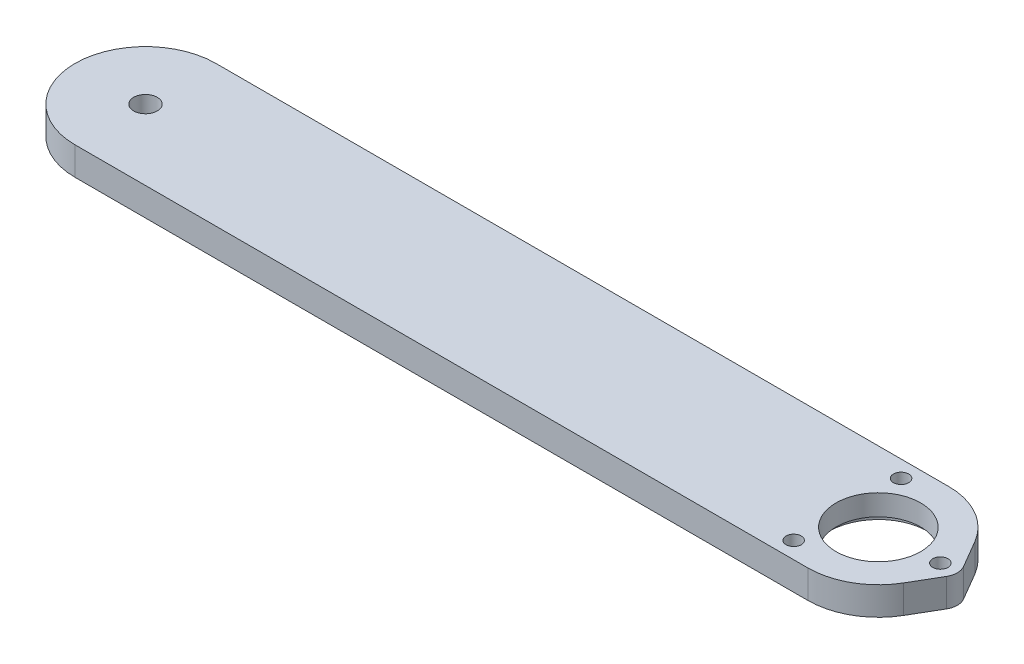
ISO-10303-21;
HEADER;
FILE_DESCRIPTION(('STEP AP214'),'2;1');
FILE_NAME('part.step','',(''),(''),'','','');
FILE_SCHEMA(('AUTOMOTIVE_DESIGN { 1 0 10303 214 1 1 1 1 }'));
ENDSEC;
DATA;
#1=APPLICATION_CONTEXT('core data for automotive mechanical design processes');
#2=APPLICATION_PROTOCOL_DEFINITION('international standard','automotive_design',2000,#1);
#3=PRODUCT_CONTEXT('',#1,'mechanical');
#4=PRODUCT('Part','Part','',(#3));
#5=PRODUCT_RELATED_PRODUCT_CATEGORY('part','',(#4));
#6=PRODUCT_DEFINITION_FORMATION('','',#4);
#7=PRODUCT_DEFINITION_CONTEXT('part definition',#1,'design');
#8=PRODUCT_DEFINITION('design','',#6,#7);
#9=PRODUCT_DEFINITION_SHAPE('','',#8);
#10=(LENGTH_UNIT() NAMED_UNIT(*) SI_UNIT(.MILLI.,.METRE.));
#11=(NAMED_UNIT(*) PLANE_ANGLE_UNIT() SI_UNIT($,.RADIAN.));
#12=(NAMED_UNIT(*) SI_UNIT($,.STERADIAN.) SOLID_ANGLE_UNIT());
#13=UNCERTAINTY_MEASURE_WITH_UNIT(LENGTH_MEASURE(1.E-05),#10,'distance_accuracy_value','');
#14=(GEOMETRIC_REPRESENTATION_CONTEXT(3) GLOBAL_UNCERTAINTY_ASSIGNED_CONTEXT((#13)) GLOBAL_UNIT_ASSIGNED_CONTEXT((#10,
#11,#12)) REPRESENTATION_CONTEXT('',''));
#15=CARTESIAN_POINT('',(0.,0.,0.));
#16=DIRECTION('',(0.,0.,1.));
#17=DIRECTION('',(1.,0.,0.));
#18=AXIS2_PLACEMENT_3D('',#15,#16,#17);
#19=CARTESIAN_POINT('',(65.,5.,0.));
#20=DIRECTION('',(0.,-1.,0.));
#21=DIRECTION('',(0.,0.,-1.));
#22=AXIS2_PLACEMENT_3D('',#19,#20,#21);
#23=CYLINDRICAL_SURFACE('',#22,12.5);
#24=CARTESIAN_POINT('',(65.,5.,0.));
#25=DIRECTION('',(0.,1.,0.));
#26=DIRECTION('',(0.,0.,1.));
#27=AXIS2_PLACEMENT_3D('',#24,#25,#26);
#28=CIRCLE('',#27,12.5);
#29=CARTESIAN_POINT('',(75.7954545454546,5.,-6.30144119682354));
#30=VERTEX_POINT('',#29);
#31=CARTESIAN_POINT('',(65.,5.,-12.5));
#32=VERTEX_POINT('',#31);
#33=EDGE_CURVE('E148',#30,#32,#28,.T.);
#34=ORIENTED_EDGE('',*,*,#33,.F.);
#35=DIRECTION('',(0.,-1.,0.));
#36=VECTOR('',#35,1.);
#37=CARTESIAN_POINT('',(75.7954545454546,18.0039131109965,-6.30144119682354));
#38=LINE('',#37,#36);
#39=CARTESIAN_POINT('',(75.7954545454546,0.,-6.30144119682354));
#40=VERTEX_POINT('',#39);
#41=EDGE_CURVE('E129',#30,#40,#38,.T.);
#42=ORIENTED_EDGE('',*,*,#41,.T.);
#43=CARTESIAN_POINT('',(65.,0.,0.));
#44=DIRECTION('',(0.,1.,0.));
#45=DIRECTION('',(0.,0.,1.));
#46=AXIS2_PLACEMENT_3D('',#43,#44,#45);
#47=CIRCLE('',#46,12.5);
#48=CARTESIAN_POINT('',(65.,0.,-12.5));
#49=VERTEX_POINT('',#48);
#50=EDGE_CURVE('E157',#40,#49,#47,.T.);
#51=ORIENTED_EDGE('',*,*,#50,.T.);
#52=DIRECTION('',(0.,-1.,0.));
#53=VECTOR('',#52,1.);
#54=CARTESIAN_POINT('',(65.,5.,-12.5));
#55=LINE('',#54,#53);
#56=EDGE_CURVE('E163',#32,#49,#55,.T.);
#57=ORIENTED_EDGE('',*,*,#56,.F.);
#58=EDGE_LOOP('',(#34,#42,#51,#57));
#59=FACE_BOUND('',#58,.T.);
#60=ADVANCED_FACE('F36',(#59),#23,.T.);
#61=CARTESIAN_POINT('',(-65.,5.,0.));
#62=DIRECTION('',(0.,-1.,0.));
#63=DIRECTION('',(0.,0.,-1.));
#64=AXIS2_PLACEMENT_3D('',#61,#62,#63);
#65=CYLINDRICAL_SURFACE('',#64,12.5);
#66=CARTESIAN_POINT('',(-65.,0.,0.));
#67=DIRECTION('',(0.,1.,0.));
#68=DIRECTION('',(0.,0.,1.));
#69=AXIS2_PLACEMENT_3D('',#66,#67,#68);
#70=CIRCLE('',#69,12.5);
#71=CARTESIAN_POINT('',(-65.,0.,-12.5));
#72=VERTEX_POINT('',#71);
#73=CARTESIAN_POINT('',(-65.,0.,12.5));
#74=VERTEX_POINT('',#73);
#75=EDGE_CURVE('E144',#72,#74,#70,.T.);
#76=ORIENTED_EDGE('',*,*,#75,.T.);
#77=DIRECTION('',(0.,-1.,0.));
#78=VECTOR('',#77,1.);
#79=CARTESIAN_POINT('',(-65.,5.,12.5));
#80=LINE('',#79,#78);
#81=CARTESIAN_POINT('',(-65.,5.,12.5));
#82=VERTEX_POINT('',#81);
#83=EDGE_CURVE('E11',#82,#74,#80,.T.);
#84=ORIENTED_EDGE('',*,*,#83,.F.);
#85=CARTESIAN_POINT('',(-65.,5.,0.));
#86=DIRECTION('',(0.,1.,0.));
#87=DIRECTION('',(0.,0.,1.));
#88=AXIS2_PLACEMENT_3D('',#85,#86,#87);
#89=CIRCLE('',#88,12.5);
#90=CARTESIAN_POINT('',(-65.,5.,-12.5));
#91=VERTEX_POINT('',#90);
#92=EDGE_CURVE('E145',#91,#82,#89,.T.);
#93=ORIENTED_EDGE('',*,*,#92,.F.);
#94=DIRECTION('',(0.,-1.,0.));
#95=VECTOR('',#94,1.);
#96=CARTESIAN_POINT('',(-65.,5.,-12.5));
#97=LINE('',#96,#95);
#98=EDGE_CURVE('E152',#91,#72,#97,.T.);
#99=ORIENTED_EDGE('',*,*,#98,.T.);
#100=EDGE_LOOP('',(#76,#84,#93,#99));
#101=FACE_BOUND('',#100,.T.);
#102=ADVANCED_FACE('F38',(#101),#65,.T.);
#103=CARTESIAN_POINT('',(-65.,5.,12.5));
#104=DIRECTION('',(0.,0.,-1.));
#105=DIRECTION('',(-1.,0.,0.));
#106=AXIS2_PLACEMENT_3D('',#103,#104,#105);
#107=PLANE('',#106);
#108=DIRECTION('',(1.,0.,0.));
#109=VECTOR('',#108,1.);
#110=CARTESIAN_POINT('',(-65.,0.,12.5));
#111=LINE('',#110,#109);
#112=CARTESIAN_POINT('',(65.,0.,12.5));
#113=VERTEX_POINT('',#112);
#114=EDGE_CURVE('E155',#74,#113,#111,.T.);
#115=ORIENTED_EDGE('',*,*,#114,.T.);
#116=DIRECTION('',(0.,-1.,0.));
#117=VECTOR('',#116,1.);
#118=CARTESIAN_POINT('',(65.,5.,12.5));
#119=LINE('',#118,#117);
#120=CARTESIAN_POINT('',(65.,5.,12.5));
#121=VERTEX_POINT('',#120);
#122=EDGE_CURVE('E45',#121,#113,#119,.T.);
#123=ORIENTED_EDGE('',*,*,#122,.F.);
#124=DIRECTION('',(1.,0.,0.));
#125=VECTOR('',#124,1.);
#126=CARTESIAN_POINT('',(-65.,5.,12.5));
#127=LINE('',#126,#125);
#128=EDGE_CURVE('E89',#82,#121,#127,.T.);
#129=ORIENTED_EDGE('',*,*,#128,.F.);
#130=ORIENTED_EDGE('',*,*,#83,.T.);
#131=EDGE_LOOP('',(#115,#123,#129,#130));
#132=FACE_BOUND('',#131,.T.);
#133=ADVANCED_FACE('F179',(#132),#107,.F.);
#134=CARTESIAN_POINT('',(75.7954545454546,0.,6.30144119682354));
#135=VERTEX_POINT('',#134);
#136=EDGE_CURVE('E158',#113,#135,#47,.T.);
#137=ORIENTED_EDGE('',*,*,#136,.T.);
#138=DIRECTION('',(0.,-1.,0.));
#139=VECTOR('',#138,1.);
#140=CARTESIAN_POINT('',(75.7954545454546,18.0039131109965,6.30144119682354));
#141=LINE('',#140,#139);
#142=CARTESIAN_POINT('',(75.7954545454546,5.,6.30144119682352));
#143=VERTEX_POINT('',#142);
#144=EDGE_CURVE('E139',#143,#135,#141,.T.);
#145=ORIENTED_EDGE('',*,*,#144,.F.);
#146=EDGE_CURVE('E149',#121,#143,#28,.T.);
#147=ORIENTED_EDGE('',*,*,#146,.F.);
#148=ORIENTED_EDGE('',*,*,#122,.T.);
#149=EDGE_LOOP('',(#137,#145,#147,#148));
#150=FACE_BOUND('',#149,.T.);
#151=ADVANCED_FACE('F169',(#150),#23,.T.);
#152=CARTESIAN_POINT('',(-65.,5.,-12.5));
#153=DIRECTION('',(0.,0.,1.));
#154=DIRECTION('',(1.,0.,0.));
#155=AXIS2_PLACEMENT_3D('',#152,#153,#154);
#156=PLANE('',#155);
#157=DIRECTION('',(-1.,0.,0.));
#158=VECTOR('',#157,1.);
#159=CARTESIAN_POINT('',(-65.,0.,-12.5));
#160=LINE('',#159,#158);
#161=EDGE_CURVE('E82',#49,#72,#160,.T.);
#162=ORIENTED_EDGE('',*,*,#161,.T.);
#163=ORIENTED_EDGE('',*,*,#98,.F.);
#164=DIRECTION('',(-1.,0.,0.));
#165=VECTOR('',#164,1.);
#166=CARTESIAN_POINT('',(-65.,5.,-12.5));
#167=LINE('',#166,#165);
#168=EDGE_CURVE('E61',#32,#91,#167,.T.);
#169=ORIENTED_EDGE('',*,*,#168,.F.);
#170=ORIENTED_EDGE('',*,*,#56,.T.);
#171=EDGE_LOOP('',(#162,#163,#169,#170));
#172=FACE_BOUND('',#171,.T.);
#173=ADVANCED_FACE('F185',(#172),#156,.F.);
#174=CARTESIAN_POINT('',(-65.,5.,0.));
#175=DIRECTION('',(0.,1.,0.));
#176=DIRECTION('',(0.,0.,1.));
#177=AXIS2_PLACEMENT_3D('',#174,#175,#176);
#178=PLANE('',#177);
#179=CARTESIAN_POINT('',(-65.,5.,0.));
#180=DIRECTION('',(0.,1.,0.));
#181=DIRECTION('',(0.,0.,1.));
#182=AXIS2_PLACEMENT_3D('',#179,#180,#181);
#183=CIRCLE('',#182,2.1);
#184=CARTESIAN_POINT('',(-65.,5.,2.1));
#185=VERTEX_POINT('',#184);
#186=EDGE_CURVE('E238',#185,#185,#183,.T.);
#187=ORIENTED_EDGE('',*,*,#186,.F.);
#188=EDGE_LOOP('',(#187));
#189=FACE_BOUND('',#188,.T.);
#190=CARTESIAN_POINT('',(59.5,5.,9.52627944162884));
#191=DIRECTION('',(0.,1.,0.));
#192=DIRECTION('',(0.,0.,1.));
#193=AXIS2_PLACEMENT_3D('',#190,#191,#192);
#194=CIRCLE('',#193,1.35);
#195=CARTESIAN_POINT('',(59.5,5.,10.8762794416288));
#196=VERTEX_POINT('',#195);
#197=EDGE_CURVE('E253',#196,#196,#194,.F.);
#198=ORIENTED_EDGE('',*,*,#197,.T.);
#199=EDGE_LOOP('',(#198));
#200=FACE_BOUND('',#199,.T.);
#201=CARTESIAN_POINT('',(76.,5.,0.));
#202=DIRECTION('',(0.,1.,0.));
#203=DIRECTION('',(0.,0.,1.));
#204=AXIS2_PLACEMENT_3D('',#201,#202,#203);
#205=CIRCLE('',#204,1.34999999999999);
#206=CARTESIAN_POINT('',(76.,5.,1.34999999999997));
#207=VERTEX_POINT('',#206);
#208=EDGE_CURVE('E259',#207,#207,#205,.F.);
#209=ORIENTED_EDGE('',*,*,#208,.T.);
#210=EDGE_LOOP('',(#209));
#211=FACE_BOUND('',#210,.T.);
#212=CARTESIAN_POINT('',(59.5,5.,-9.52627944162882));
#213=DIRECTION('',(0.,1.,0.));
#214=DIRECTION('',(0.,0.,1.));
#215=AXIS2_PLACEMENT_3D('',#212,#213,#214);
#216=CIRCLE('',#215,1.35);
#217=CARTESIAN_POINT('',(59.5,5.,-8.17627944162882));
#218=VERTEX_POINT('',#217);
#219=EDGE_CURVE('E242',#218,#218,#216,.F.);
#220=ORIENTED_EDGE('',*,*,#219,.T.);
#221=EDGE_LOOP('',(#220));
#222=FACE_BOUND('',#221,.T.);
#223=CARTESIAN_POINT('',(65.,5.,0.));
#224=DIRECTION('',(0.,1.,0.));
#225=DIRECTION('',(0.,0.,1.));
#226=AXIS2_PLACEMENT_3D('',#223,#224,#225);
#227=CIRCLE('',#226,7.50000000000001);
#228=CARTESIAN_POINT('',(65.,5.,7.50000000000001));
#229=VERTEX_POINT('',#228);
#230=EDGE_CURVE('E269',#229,#229,#227,.T.);
#231=ORIENTED_EDGE('',*,*,#230,.F.);
#232=EDGE_LOOP('',(#231));
#233=FACE_BOUND('',#232,.T.);
#234=ORIENTED_EDGE('',*,*,#146,.T.);
#235=DIRECTION('',(-0.504115295745882,0.,0.863636363636364));
#236=VECTOR('',#235,1.);
#237=CARTESIAN_POINT('',(75.7954545454546,5.,6.30144119682354));
#238=LINE('',#237,#236);
#239=CARTESIAN_POINT('',(78.5909090909091,5.,1.51234588723765));
#240=VERTEX_POINT('',#239);
#241=EDGE_CURVE('E52',#240,#143,#238,.T.);
#242=ORIENTED_EDGE('',*,*,#241,.F.);
#243=CARTESIAN_POINT('',(76.,5.,0.));
#244=DIRECTION('',(0.,1.,0.));
#245=DIRECTION('',(0.,0.,1.));
#246=AXIS2_PLACEMENT_3D('',#243,#244,#245);
#247=CIRCLE('',#246,3.);
#248=CARTESIAN_POINT('',(78.5909090909091,5.,-1.51234588723765));
#249=VERTEX_POINT('',#248);
#250=EDGE_CURVE('E109',#249,#240,#247,.F.);
#251=ORIENTED_EDGE('',*,*,#250,.F.);
#252=DIRECTION('',(0.504115295745882,0.,0.863636363636364));
#253=VECTOR('',#252,1.);
#254=CARTESIAN_POINT('',(75.7954545454546,5.,-6.30144119682354));
#255=LINE('',#254,#253);
#256=EDGE_CURVE('E114',#30,#249,#255,.T.);
#257=ORIENTED_EDGE('',*,*,#256,.F.);
#258=ORIENTED_EDGE('',*,*,#33,.T.);
#259=ORIENTED_EDGE('',*,*,#168,.T.);
#260=ORIENTED_EDGE('',*,*,#92,.T.);
#261=ORIENTED_EDGE('',*,*,#128,.T.);
#262=EDGE_LOOP('',(#234,#242,#251,#257,#258,#259,#260,#261));
#263=FACE_BOUND('',#262,.T.);
#264=ADVANCED_FACE('F112',(#189,#200,#211,#222,#233,#263),#178,.T.);
#265=CARTESIAN_POINT('',(-65.,0.,0.));
#266=DIRECTION('',(0.,1.,0.));
#267=DIRECTION('',(0.,0.,1.));
#268=AXIS2_PLACEMENT_3D('',#265,#266,#267);
#269=PLANE('',#268);
#270=CARTESIAN_POINT('',(-65.,0.,0.));
#271=DIRECTION('',(0.,1.,0.));
#272=DIRECTION('',(0.,0.,1.));
#273=AXIS2_PLACEMENT_3D('',#270,#271,#272);
#274=CIRCLE('',#273,2.1);
#275=CARTESIAN_POINT('',(-65.,0.,2.1));
#276=VERTEX_POINT('',#275);
#277=EDGE_CURVE('E241',#276,#276,#274,.F.);
#278=ORIENTED_EDGE('',*,*,#277,.F.);
#279=EDGE_LOOP('',(#278));
#280=FACE_BOUND('',#279,.T.);
#281=CARTESIAN_POINT('',(59.5,0.,9.52627944162884));
#282=DIRECTION('',(0.,-1.,0.));
#283=DIRECTION('',(0.,0.,-1.));
#284=AXIS2_PLACEMENT_3D('',#281,#282,#283);
#285=CIRCLE('',#284,1.35);
#286=CARTESIAN_POINT('',(59.5,0.,8.17627944162884));
#287=VERTEX_POINT('',#286);
#288=EDGE_CURVE('E249',#287,#287,#285,.T.);
#289=ORIENTED_EDGE('',*,*,#288,.F.);
#290=EDGE_LOOP('',(#289));
#291=FACE_BOUND('',#290,.T.);
#292=CARTESIAN_POINT('',(76.,0.,0.));
#293=DIRECTION('',(0.,-1.,0.));
#294=DIRECTION('',(0.,0.,-1.));
#295=AXIS2_PLACEMENT_3D('',#292,#293,#294);
#296=CIRCLE('',#295,1.34999999999999);
#297=CARTESIAN_POINT('',(76.,0.,-1.35000000000001));
#298=VERTEX_POINT('',#297);
#299=EDGE_CURVE('E256',#298,#298,#296,.T.);
#300=ORIENTED_EDGE('',*,*,#299,.F.);
#301=EDGE_LOOP('',(#300));
#302=FACE_BOUND('',#301,.T.);
#303=CARTESIAN_POINT('',(59.5,0.,-9.52627944162882));
#304=DIRECTION('',(0.,-1.,0.));
#305=DIRECTION('',(0.,0.,-1.));
#306=AXIS2_PLACEMENT_3D('',#303,#304,#305);
#307=CIRCLE('',#306,1.35);
#308=CARTESIAN_POINT('',(59.5,0.,-10.8762794416288));
#309=VERTEX_POINT('',#308);
#310=EDGE_CURVE('E245',#309,#309,#307,.T.);
#311=ORIENTED_EDGE('',*,*,#310,.F.);
#312=EDGE_LOOP('',(#311));
#313=FACE_BOUND('',#312,.T.);
#314=CARTESIAN_POINT('',(65.,0.,0.));
#315=DIRECTION('',(0.,1.,0.));
#316=DIRECTION('',(0.,0.,1.));
#317=AXIS2_PLACEMENT_3D('',#314,#315,#316);
#318=CIRCLE('',#317,8.75000000000001);
#319=CARTESIAN_POINT('',(65.,0.,8.75000000000001));
#320=VERTEX_POINT('',#319);
#321=EDGE_CURVE('E252',#320,#320,#318,.T.);
#322=ORIENTED_EDGE('',*,*,#321,.T.);
#323=EDGE_LOOP('',(#322));
#324=FACE_BOUND('',#323,.T.);
#325=ORIENTED_EDGE('',*,*,#50,.F.);
#326=DIRECTION('',(0.504115295745882,0.,0.863636363636364));
#327=VECTOR('',#326,1.);
#328=CARTESIAN_POINT('',(75.7954545454546,0.,-6.30144119682354));
#329=LINE('',#328,#327);
#330=CARTESIAN_POINT('',(78.5909090909091,0.,-1.51234588723765));
#331=VERTEX_POINT('',#330);
#332=EDGE_CURVE('E137',#40,#331,#329,.T.);
#333=ORIENTED_EDGE('',*,*,#332,.T.);
#334=CARTESIAN_POINT('',(76.,0.,0.));
#335=DIRECTION('',(0.,-1.,0.));
#336=DIRECTION('',(0.,0.,-1.));
#337=AXIS2_PLACEMENT_3D('',#334,#335,#336);
#338=CIRCLE('',#337,3.);
#339=CARTESIAN_POINT('',(78.5909090909091,0.,1.51234588723765));
#340=VERTEX_POINT('',#339);
#341=EDGE_CURVE('E123',#331,#340,#338,.T.);
#342=ORIENTED_EDGE('',*,*,#341,.T.);
#343=DIRECTION('',(-0.504115295745881,0.,0.863636363636364));
#344=VECTOR('',#343,1.);
#345=CARTESIAN_POINT('',(75.7954545454546,0.,6.30144119682354));
#346=LINE('',#345,#344);
#347=EDGE_CURVE('E131',#340,#135,#346,.T.);
#348=ORIENTED_EDGE('',*,*,#347,.T.);
#349=ORIENTED_EDGE('',*,*,#136,.F.);
#350=ORIENTED_EDGE('',*,*,#114,.F.);
#351=ORIENTED_EDGE('',*,*,#75,.F.);
#352=ORIENTED_EDGE('',*,*,#161,.F.);
#353=EDGE_LOOP('',(#325,#333,#342,#348,#349,#350,#351,#352));
#354=FACE_BOUND('',#353,.T.);
#355=ADVANCED_FACE('F172',(#280,#291,#302,#313,#324,#354),#269,.F.);
#356=CARTESIAN_POINT('',(75.7954545454546,18.0039131109965,-6.30144119682354));
#357=DIRECTION('',(0.863636363636364,0.,-0.504115295745882));
#358=DIRECTION('',(-0.504115295745882,0.,-0.863636363636364));
#359=AXIS2_PLACEMENT_3D('',#356,#357,#358);
#360=PLANE('',#359);
#361=ORIENTED_EDGE('',*,*,#41,.F.);
#362=ORIENTED_EDGE('',*,*,#256,.T.);
#363=DIRECTION('',(0.,-1.,0.));
#364=VECTOR('',#363,1.);
#365=CARTESIAN_POINT('',(78.5909090909091,18.0039131109965,-1.51234588723765));
#366=LINE('',#365,#364);
#367=EDGE_CURVE('E118',#249,#331,#366,.T.);
#368=ORIENTED_EDGE('',*,*,#367,.T.);
#369=ORIENTED_EDGE('',*,*,#332,.F.);
#370=EDGE_LOOP('',(#361,#362,#368,#369));
#371=FACE_BOUND('',#370,.T.);
#372=ADVANCED_FACE('F127',(#371),#360,.T.);
#373=CARTESIAN_POINT('',(76.,18.0039131109965,0.));
#374=DIRECTION('',(0.,-1.,0.));
#375=DIRECTION('',(0.,0.,-1.));
#376=AXIS2_PLACEMENT_3D('',#373,#374,#375);
#377=CYLINDRICAL_SURFACE('',#376,3.);
#378=ORIENTED_EDGE('',*,*,#367,.F.);
#379=ORIENTED_EDGE('',*,*,#250,.T.);
#380=DIRECTION('',(0.,-1.,0.));
#381=VECTOR('',#380,1.);
#382=CARTESIAN_POINT('',(78.5909090909091,18.0039131109965,1.51234588723765));
#383=LINE('',#382,#381);
#384=EDGE_CURVE('E117',#240,#340,#383,.T.);
#385=ORIENTED_EDGE('',*,*,#384,.T.);
#386=ORIENTED_EDGE('',*,*,#341,.F.);
#387=EDGE_LOOP('',(#378,#379,#385,#386));
#388=FACE_BOUND('',#387,.T.);
#389=ADVANCED_FACE('F121',(#388),#377,.T.);
#390=CARTESIAN_POINT('',(75.7954545454546,18.0039131109965,6.30144119682354));
#391=DIRECTION('',(0.863636363636364,0.,0.504115295745882));
#392=DIRECTION('',(0.504115295745882,0.,-0.863636363636364));
#393=AXIS2_PLACEMENT_3D('',#390,#391,#392);
#394=PLANE('',#393);
#395=ORIENTED_EDGE('',*,*,#384,.F.);
#396=ORIENTED_EDGE('',*,*,#241,.T.);
#397=ORIENTED_EDGE('',*,*,#144,.T.);
#398=ORIENTED_EDGE('',*,*,#347,.F.);
#399=EDGE_LOOP('',(#395,#396,#397,#398));
#400=FACE_BOUND('',#399,.T.);
#401=ADVANCED_FACE('F175',(#400),#394,.T.);
#402=CARTESIAN_POINT('',(65.,-0.00100000000000013,0.));
#403=DIRECTION('',(0.,1.,0.));
#404=DIRECTION('',(0.,0.,1.));
#405=AXIS2_PLACEMENT_3D('',#402,#403,#404);
#406=CYLINDRICAL_SURFACE('',#405,7.50000000000001);
#407=CARTESIAN_POINT('',(65.,1.3,0.));
#408=DIRECTION('',(0.,1.,0.));
#409=DIRECTION('',(0.,0.,1.));
#410=AXIS2_PLACEMENT_3D('',#407,#408,#409);
#411=CIRCLE('',#410,7.50000000000001);
#412=CARTESIAN_POINT('',(65.,1.3,7.50000000000001));
#413=VERTEX_POINT('',#412);
#414=EDGE_CURVE('E40',#413,#413,#411,.F.);
#415=ORIENTED_EDGE('',*,*,#414,.T.);
#416=EDGE_LOOP('',(#415));
#417=FACE_BOUND('',#416,.T.);
#418=ORIENTED_EDGE('',*,*,#230,.T.);
#419=EDGE_LOOP('',(#418));
#420=FACE_BOUND('',#419,.T.);
#421=ADVANCED_FACE('F206',(#417,#420),#406,.F.);
#422=CARTESIAN_POINT('',(65.,1.3,0.));
#423=DIRECTION('',(0.,1.,0.));
#424=DIRECTION('',(0.,0.,1.));
#425=AXIS2_PLACEMENT_3D('',#422,#423,#424);
#426=PLANE('',#425);
#427=CARTESIAN_POINT('',(65.,1.3,0.));
#428=DIRECTION('',(0.,1.,0.));
#429=DIRECTION('',(0.,0.,1.));
#430=AXIS2_PLACEMENT_3D('',#427,#428,#429);
#431=CIRCLE('',#430,8.75000000000001);
#432=CARTESIAN_POINT('',(65.,1.3,8.75000000000001));
#433=VERTEX_POINT('',#432);
#434=EDGE_CURVE('E264',#433,#433,#431,.T.);
#435=ORIENTED_EDGE('',*,*,#434,.F.);
#436=EDGE_LOOP('',(#435));
#437=FACE_BOUND('',#436,.T.);
#438=ORIENTED_EDGE('',*,*,#414,.F.);
#439=EDGE_LOOP('',(#438));
#440=FACE_BOUND('',#439,.T.);
#441=ADVANCED_FACE('F209',(#437,#440),#426,.F.);
#442=CARTESIAN_POINT('',(65.,1.3,0.));
#443=DIRECTION('',(0.,-1.,0.));
#444=DIRECTION('',(0.,0.,-1.));
#445=AXIS2_PLACEMENT_3D('',#442,#443,#444);
#446=CYLINDRICAL_SURFACE('',#445,8.75000000000001);
#447=ORIENTED_EDGE('',*,*,#434,.T.);
#448=EDGE_LOOP('',(#447));
#449=FACE_BOUND('',#448,.T.);
#450=ORIENTED_EDGE('',*,*,#321,.F.);
#451=EDGE_LOOP('',(#450));
#452=FACE_BOUND('',#451,.T.);
#453=ADVANCED_FACE('F211',(#449,#452),#446,.F.);
#454=CARTESIAN_POINT('',(59.5,5.001,-9.52627944162882));
#455=DIRECTION('',(0.,-1.,0.));
#456=DIRECTION('',(0.,0.,-1.));
#457=AXIS2_PLACEMENT_3D('',#454,#455,#456);
#458=CYLINDRICAL_SURFACE('',#457,1.35);
#459=ORIENTED_EDGE('',*,*,#219,.F.);
#460=EDGE_LOOP('',(#459));
#461=FACE_BOUND('',#460,.T.);
#462=ORIENTED_EDGE('',*,*,#310,.T.);
#463=EDGE_LOOP('',(#462));
#464=FACE_BOUND('',#463,.T.);
#465=ADVANCED_FACE('F214',(#461,#464),#458,.F.);
#466=CARTESIAN_POINT('',(76.,5.001,0.));
#467=DIRECTION('',(0.,-1.,0.));
#468=DIRECTION('',(0.,0.,-1.));
#469=AXIS2_PLACEMENT_3D('',#466,#467,#468);
#470=CYLINDRICAL_SURFACE('',#469,1.34999999999999);
#471=ORIENTED_EDGE('',*,*,#208,.F.);
#472=EDGE_LOOP('',(#471));
#473=FACE_BOUND('',#472,.T.);
#474=ORIENTED_EDGE('',*,*,#299,.T.);
#475=EDGE_LOOP('',(#474));
#476=FACE_BOUND('',#475,.T.);
#477=ADVANCED_FACE('F221',(#473,#476),#470,.F.);
#478=CARTESIAN_POINT('',(59.5,5.001,9.52627944162884));
#479=DIRECTION('',(0.,-1.,0.));
#480=DIRECTION('',(0.,0.,-1.));
#481=AXIS2_PLACEMENT_3D('',#478,#479,#480);
#482=CYLINDRICAL_SURFACE('',#481,1.35);
#483=ORIENTED_EDGE('',*,*,#197,.F.);
#484=EDGE_LOOP('',(#483));
#485=FACE_BOUND('',#484,.T.);
#486=ORIENTED_EDGE('',*,*,#288,.T.);
#487=EDGE_LOOP('',(#486));
#488=FACE_BOUND('',#487,.T.);
#489=ADVANCED_FACE('F225',(#485,#488),#482,.F.);
#490=CARTESIAN_POINT('',(-65.,-0.00100000000000013,0.));
#491=DIRECTION('',(0.,1.,0.));
#492=DIRECTION('',(0.,0.,1.));
#493=AXIS2_PLACEMENT_3D('',#490,#491,#492);
#494=CYLINDRICAL_SURFACE('',#493,2.1);
#495=ORIENTED_EDGE('',*,*,#186,.T.);
#496=EDGE_LOOP('',(#495));
#497=FACE_BOUND('',#496,.T.);
#498=ORIENTED_EDGE('',*,*,#277,.T.);
#499=EDGE_LOOP('',(#498));
#500=FACE_BOUND('',#499,.T.);
#501=ADVANCED_FACE('F229',(#497,#500),#494,.F.);
#502=CLOSED_SHELL('',(#60,#102,#133,#151,#173,#264,#355,#372,#389,#401,#421,#441,#453,#465,#477,
#489,#501));
#503=MANIFOLD_SOLID_BREP('B2',#502);
#504=ADVANCED_BREP_SHAPE_REPRESENTATION('',(#18,#503),#14);
#505=SHAPE_DEFINITION_REPRESENTATION(#9,#504);
ENDSEC;
END-ISO-10303-21;
